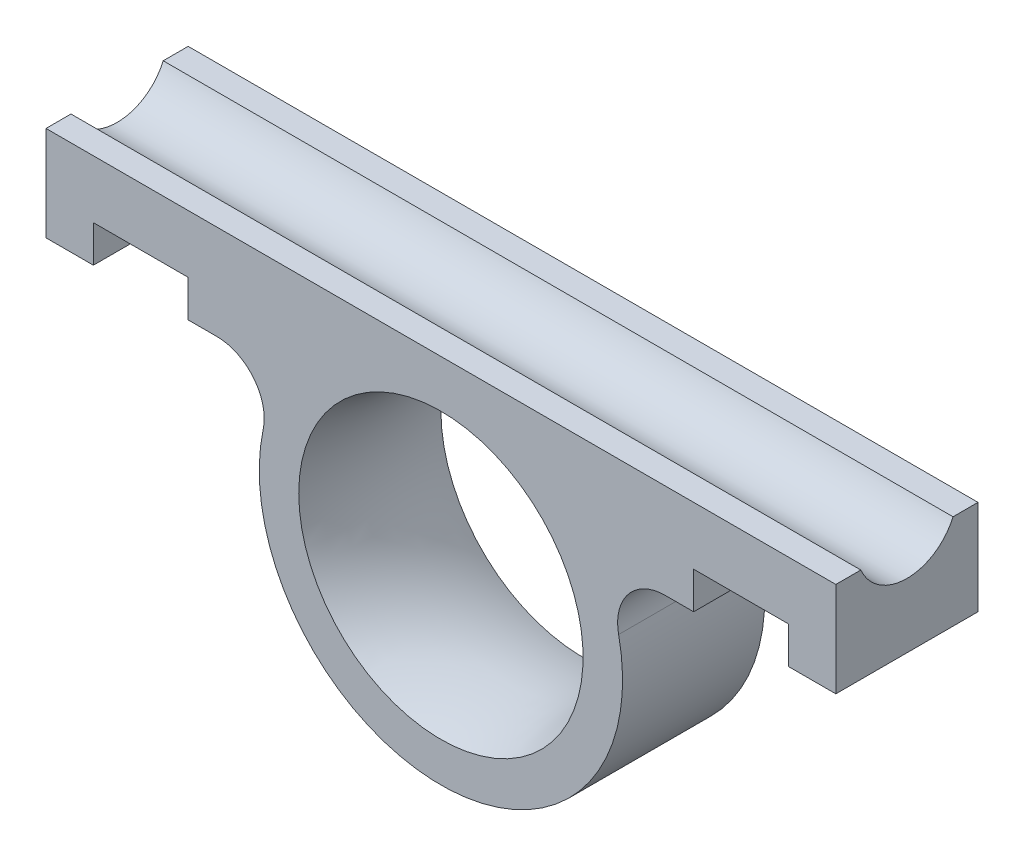
ISO-10303-21;
HEADER;
FILE_DESCRIPTION(('STEP AP214'),'2;1');
FILE_NAME('part.step','',(''),(''),'','','');
FILE_SCHEMA(('AUTOMOTIVE_DESIGN { 1 0 10303 214 1 1 1 1 }'));
ENDSEC;
DATA;
#1=APPLICATION_CONTEXT('core data for automotive mechanical design processes');
#2=APPLICATION_PROTOCOL_DEFINITION('international standard','automotive_design',2000,#1);
#3=PRODUCT_CONTEXT('',#1,'mechanical');
#4=PRODUCT('Part','Part','',(#3));
#5=PRODUCT_RELATED_PRODUCT_CATEGORY('part','',(#4));
#6=PRODUCT_DEFINITION_FORMATION('','',#4);
#7=PRODUCT_DEFINITION_CONTEXT('part definition',#1,'design');
#8=PRODUCT_DEFINITION('design','',#6,#7);
#9=PRODUCT_DEFINITION_SHAPE('','',#8);
#10=(LENGTH_UNIT() NAMED_UNIT(*) SI_UNIT(.MILLI.,.METRE.));
#11=(NAMED_UNIT(*) PLANE_ANGLE_UNIT() SI_UNIT($,.RADIAN.));
#12=(NAMED_UNIT(*) SI_UNIT($,.STERADIAN.) SOLID_ANGLE_UNIT());
#13=UNCERTAINTY_MEASURE_WITH_UNIT(LENGTH_MEASURE(1.E-05),#10,'distance_accuracy_value','');
#14=(GEOMETRIC_REPRESENTATION_CONTEXT(3) GLOBAL_UNCERTAINTY_ASSIGNED_CONTEXT((#13)) GLOBAL_UNIT_ASSIGNED_CONTEXT((#10,
#11,#12)) REPRESENTATION_CONTEXT('',''));
#15=CARTESIAN_POINT('',(0.,0.,0.));
#16=DIRECTION('',(0.,0.,1.));
#17=DIRECTION('',(1.,0.,0.));
#18=AXIS2_PLACEMENT_3D('',#15,#16,#17);
#19=CARTESIAN_POINT('',(-14.1862609591111,3.,9.));
#20=DIRECTION('',(0.,0.,1.));
#21=DIRECTION('',(1.,0.,0.));
#22=AXIS2_PLACEMENT_3D('',#19,#20,#21);
#23=PLANE('',#22);
#24=CARTESIAN_POINT('',(0.,0.,9.));
#25=DIRECTION('',(0.,0.,-1.));
#26=DIRECTION('',(-1.,0.,0.));
#27=AXIS2_PLACEMENT_3D('',#24,#25,#26);
#28=CIRCLE('',#27,9.);
#29=CARTESIAN_POINT('',(-9.,0.,9.));
#30=VERTEX_POINT('',#29);
#31=EDGE_CURVE('E275',#30,#30,#28,.T.);
#32=ORIENTED_EDGE('',*,*,#31,.T.);
#33=EDGE_LOOP('',(#32));
#34=FACE_BOUND('',#33,.T.);
#35=DIRECTION('',(-1.,0.,0.));
#36=VECTOR('',#35,1.);
#37=CARTESIAN_POINT('',(31.2980546704707,8.33534165703035,9.));
#38=LINE('',#37,#36);
#39=CARTESIAN_POINT('',(22.,8.33534165703035,9.));
#40=VERTEX_POINT('',#39);
#41=CARTESIAN_POINT('',(16.,8.33534165703035,9.));
#42=VERTEX_POINT('',#41);
#43=EDGE_CURVE('E261',#40,#42,#38,.T.);
#44=ORIENTED_EDGE('',*,*,#43,.F.);
#45=DIRECTION('',(0.,-1.,0.));
#46=VECTOR('',#45,1.);
#47=CARTESIAN_POINT('',(22.,7.00000000000001,9.));
#48=LINE('',#47,#46);
#49=CARTESIAN_POINT('',(22.,6.00000000000001,9.));
#50=VERTEX_POINT('',#49);
#51=EDGE_CURVE('E145',#40,#50,#48,.T.);
#52=ORIENTED_EDGE('',*,*,#51,.T.);
#53=DIRECTION('',(1.,0.,0.));
#54=VECTOR('',#53,1.);
#55=CARTESIAN_POINT('',(22.,6.00000000000001,9.));
#56=LINE('',#55,#54);
#57=CARTESIAN_POINT('',(25.,6.00000000000001,9.));
#58=VERTEX_POINT('',#57);
#59=EDGE_CURVE('E138',#50,#58,#56,.T.);
#60=ORIENTED_EDGE('',*,*,#59,.T.);
#61=DIRECTION('',(0.,1.,0.));
#62=VECTOR('',#61,1.);
#63=CARTESIAN_POINT('',(25.,12.,9.));
#64=LINE('',#63,#62);
#65=CARTESIAN_POINT('',(25.,12.,9.));
#66=VERTEX_POINT('',#65);
#67=EDGE_CURVE('E142',#58,#66,#64,.T.);
#68=ORIENTED_EDGE('',*,*,#67,.T.);
#69=DIRECTION('',(-1.,0.,0.));
#70=VECTOR('',#69,1.);
#71=CARTESIAN_POINT('',(-25.,12.,9.));
#72=LINE('',#71,#70);
#73=CARTESIAN_POINT('',(-25.,12.,9.));
#74=VERTEX_POINT('',#73);
#75=EDGE_CURVE('E57',#66,#74,#72,.T.);
#76=ORIENTED_EDGE('',*,*,#75,.T.);
#77=DIRECTION('',(0.,-1.,0.));
#78=VECTOR('',#77,1.);
#79=CARTESIAN_POINT('',(-25.,12.,9.));
#80=LINE('',#79,#78);
#81=CARTESIAN_POINT('',(-25.,6.,9.));
#82=VERTEX_POINT('',#81);
#83=EDGE_CURVE('E198',#74,#82,#80,.T.);
#84=ORIENTED_EDGE('',*,*,#83,.T.);
#85=DIRECTION('',(1.,0.,0.));
#86=VECTOR('',#85,1.);
#87=CARTESIAN_POINT('',(-25.,6.,9.));
#88=LINE('',#87,#86);
#89=CARTESIAN_POINT('',(-22.,6.,9.));
#90=VERTEX_POINT('',#89);
#91=EDGE_CURVE('E111',#82,#90,#88,.T.);
#92=ORIENTED_EDGE('',*,*,#91,.T.);
#93=DIRECTION('',(0.,1.,0.));
#94=VECTOR('',#93,1.);
#95=CARTESIAN_POINT('',(-22.,6.,9.));
#96=LINE('',#95,#94);
#97=CARTESIAN_POINT('',(-22.,8.33534165703034,9.));
#98=VERTEX_POINT('',#97);
#99=EDGE_CURVE('E234',#90,#98,#96,.T.);
#100=ORIENTED_EDGE('',*,*,#99,.T.);
#101=DIRECTION('',(-1.,0.,0.));
#102=VECTOR('',#101,1.);
#103=CARTESIAN_POINT('',(23.0812579761706,8.33534165703042,9.));
#104=LINE('',#103,#102);
#105=CARTESIAN_POINT('',(-16.,8.33534165703035,9.));
#106=VERTEX_POINT('',#105);
#107=EDGE_CURVE('E295',#106,#98,#104,.T.);
#108=ORIENTED_EDGE('',*,*,#107,.F.);
#109=DIRECTION('',(0.,-1.,0.));
#110=VECTOR('',#109,1.);
#111=CARTESIAN_POINT('',(-16.,7.,9.));
#112=LINE('',#111,#110);
#113=CARTESIAN_POINT('',(-16.,6.,9.));
#114=VERTEX_POINT('',#113);
#115=EDGE_CURVE('E242',#106,#114,#112,.T.);
#116=ORIENTED_EDGE('',*,*,#115,.T.);
#117=DIRECTION('',(1.,0.,0.));
#118=VECTOR('',#117,1.);
#119=CARTESIAN_POINT('',(-16.,6.,9.));
#120=LINE('',#119,#118);
#121=CARTESIAN_POINT('',(-14.1862609591111,6.,9.));
#122=VERTEX_POINT('',#121);
#123=EDGE_CURVE('E244',#114,#122,#120,.T.);
#124=ORIENTED_EDGE('',*,*,#123,.T.);
#125=CARTESIAN_POINT('',(-14.1862609591111,3.,9.));
#126=DIRECTION('',(0.,0.,-1.));
#127=DIRECTION('',(1.,0.,0.));
#128=AXIS2_PLACEMENT_3D('',#125,#126,#127);
#129=CIRCLE('',#128,3.);
#130=CARTESIAN_POINT('',(-11.2511724848123,2.37931034482759,9.));
#131=VERTEX_POINT('',#130);
#132=EDGE_CURVE('E246',#122,#131,#129,.T.);
#133=ORIENTED_EDGE('',*,*,#132,.T.);
#134=CARTESIAN_POINT('',(0.,0.,9.));
#135=DIRECTION('',(0.,0.,1.));
#136=DIRECTION('',(1.,0.,0.));
#137=AXIS2_PLACEMENT_3D('',#134,#135,#136);
#138=CIRCLE('',#137,11.5);
#139=CARTESIAN_POINT('',(11.2511724848123,2.37931034482759,9.));
#140=VERTEX_POINT('',#139);
#141=EDGE_CURVE('E248',#131,#140,#138,.T.);
#142=ORIENTED_EDGE('',*,*,#141,.T.);
#143=CARTESIAN_POINT('',(14.1862609591111,3.,9.));
#144=DIRECTION('',(0.,0.,-1.));
#145=DIRECTION('',(1.,0.,0.));
#146=AXIS2_PLACEMENT_3D('',#143,#144,#145);
#147=CIRCLE('',#146,3.);
#148=CARTESIAN_POINT('',(14.1862609591111,6.,9.));
#149=VERTEX_POINT('',#148);
#150=EDGE_CURVE('E250',#140,#149,#147,.T.);
#151=ORIENTED_EDGE('',*,*,#150,.T.);
#152=DIRECTION('',(1.,0.,0.));
#153=VECTOR('',#152,1.);
#154=CARTESIAN_POINT('',(14.1862609591111,6.,9.));
#155=LINE('',#154,#153);
#156=CARTESIAN_POINT('',(16.,6.,9.));
#157=VERTEX_POINT('',#156);
#158=EDGE_CURVE('E252',#149,#157,#155,.T.);
#159=ORIENTED_EDGE('',*,*,#158,.T.);
#160=DIRECTION('',(0.,1.,0.));
#161=VECTOR('',#160,1.);
#162=CARTESIAN_POINT('',(16.,6.,9.));
#163=LINE('',#162,#161);
#164=EDGE_CURVE('E254',#157,#42,#163,.T.);
#165=ORIENTED_EDGE('',*,*,#164,.T.);
#166=EDGE_LOOP('',(#44,#52,#60,#68,#76,#84,#92,#100,#108,#116,#124,#133,#142,#151,#159,#165));
#167=FACE_BOUND('',#166,.T.);
#168=ADVANCED_FACE('F33',(#34,#167),#23,.T.);
#169=CARTESIAN_POINT('',(-14.1862609591111,3.,0.));
#170=DIRECTION('',(0.,0.,1.));
#171=DIRECTION('',(1.,0.,0.));
#172=AXIS2_PLACEMENT_3D('',#169,#170,#171);
#173=PLANE('',#172);
#174=CARTESIAN_POINT('',(0.,0.,0.));
#175=DIRECTION('',(0.,0.,-1.));
#176=DIRECTION('',(-1.,0.,0.));
#177=AXIS2_PLACEMENT_3D('',#174,#175,#176);
#178=CIRCLE('',#177,9.);
#179=CARTESIAN_POINT('',(-9.,0.,0.));
#180=VERTEX_POINT('',#179);
#181=EDGE_CURVE('E416',#180,#180,#178,.T.);
#182=ORIENTED_EDGE('',*,*,#181,.F.);
#183=EDGE_LOOP('',(#182));
#184=FACE_BOUND('',#183,.T.);
#185=DIRECTION('',(0.,-1.,0.));
#186=VECTOR('',#185,1.);
#187=CARTESIAN_POINT('',(22.,7.00000000000001,0.));
#188=LINE('',#187,#186);
#189=CARTESIAN_POINT('',(22.,8.33534165703035,0.));
#190=VERTEX_POINT('',#189);
#191=CARTESIAN_POINT('',(22.,6.00000000000001,0.));
#192=VERTEX_POINT('',#191);
#193=EDGE_CURVE('E191',#190,#192,#188,.T.);
#194=ORIENTED_EDGE('',*,*,#193,.F.);
#195=DIRECTION('',(-1.,0.,0.));
#196=VECTOR('',#195,1.);
#197=CARTESIAN_POINT('',(31.2980546704707,8.33534165703035,0.));
#198=LINE('',#197,#196);
#199=CARTESIAN_POINT('',(16.,8.33534165703035,0.));
#200=VERTEX_POINT('',#199);
#201=EDGE_CURVE('E282',#190,#200,#198,.T.);
#202=ORIENTED_EDGE('',*,*,#201,.T.);
#203=DIRECTION('',(0.,1.,0.));
#204=VECTOR('',#203,1.);
#205=CARTESIAN_POINT('',(16.,6.,0.));
#206=LINE('',#205,#204);
#207=CARTESIAN_POINT('',(16.,6.,0.));
#208=VERTEX_POINT('',#207);
#209=EDGE_CURVE('E188',#208,#200,#206,.T.);
#210=ORIENTED_EDGE('',*,*,#209,.F.);
#211=DIRECTION('',(1.,0.,0.));
#212=VECTOR('',#211,1.);
#213=CARTESIAN_POINT('',(14.1862609591111,6.,0.));
#214=LINE('',#213,#212);
#215=CARTESIAN_POINT('',(14.1862609591111,6.,0.));
#216=VERTEX_POINT('',#215);
#217=EDGE_CURVE('E186',#216,#208,#214,.T.);
#218=ORIENTED_EDGE('',*,*,#217,.F.);
#219=CARTESIAN_POINT('',(14.1862609591111,3.,0.));
#220=DIRECTION('',(0.,0.,-1.));
#221=DIRECTION('',(1.,0.,0.));
#222=AXIS2_PLACEMENT_3D('',#219,#220,#221);
#223=CIRCLE('',#222,3.);
#224=CARTESIAN_POINT('',(11.2511724848123,2.37931034482759,0.));
#225=VERTEX_POINT('',#224);
#226=EDGE_CURVE('E184',#225,#216,#223,.T.);
#227=ORIENTED_EDGE('',*,*,#226,.F.);
#228=CARTESIAN_POINT('',(0.,0.,0.));
#229=DIRECTION('',(0.,0.,1.));
#230=DIRECTION('',(1.,0.,0.));
#231=AXIS2_PLACEMENT_3D('',#228,#229,#230);
#232=CIRCLE('',#231,11.5);
#233=CARTESIAN_POINT('',(-11.2511724848123,2.37931034482759,0.));
#234=VERTEX_POINT('',#233);
#235=EDGE_CURVE('E182',#234,#225,#232,.T.);
#236=ORIENTED_EDGE('',*,*,#235,.F.);
#237=CARTESIAN_POINT('',(-14.1862609591111,3.,0.));
#238=DIRECTION('',(0.,0.,-1.));
#239=DIRECTION('',(1.,0.,0.));
#240=AXIS2_PLACEMENT_3D('',#237,#238,#239);
#241=CIRCLE('',#240,3.);
#242=CARTESIAN_POINT('',(-14.1862609591111,6.,0.));
#243=VERTEX_POINT('',#242);
#244=EDGE_CURVE('E180',#243,#234,#241,.T.);
#245=ORIENTED_EDGE('',*,*,#244,.F.);
#246=DIRECTION('',(1.,0.,0.));
#247=VECTOR('',#246,1.);
#248=CARTESIAN_POINT('',(-16.,6.,0.));
#249=LINE('',#248,#247);
#250=CARTESIAN_POINT('',(-16.,6.,0.));
#251=VERTEX_POINT('',#250);
#252=EDGE_CURVE('E178',#251,#243,#249,.T.);
#253=ORIENTED_EDGE('',*,*,#252,.F.);
#254=DIRECTION('',(0.,-1.,0.));
#255=VECTOR('',#254,1.);
#256=CARTESIAN_POINT('',(-16.,7.,0.));
#257=LINE('',#256,#255);
#258=CARTESIAN_POINT('',(-16.,8.33534165703035,0.));
#259=VERTEX_POINT('',#258);
#260=EDGE_CURVE('E176',#259,#251,#257,.T.);
#261=ORIENTED_EDGE('',*,*,#260,.F.);
#262=DIRECTION('',(-1.,0.,0.));
#263=VECTOR('',#262,1.);
#264=CARTESIAN_POINT('',(23.0812579761706,8.33534165703042,0.));
#265=LINE('',#264,#263);
#266=CARTESIAN_POINT('',(-22.,8.33534165703034,0.));
#267=VERTEX_POINT('',#266);
#268=EDGE_CURVE('E290',#259,#267,#265,.T.);
#269=ORIENTED_EDGE('',*,*,#268,.T.);
#270=DIRECTION('',(0.,1.,0.));
#271=VECTOR('',#270,1.);
#272=CARTESIAN_POINT('',(-22.,6.,0.));
#273=LINE('',#272,#271);
#274=CARTESIAN_POINT('',(-22.,6.,0.));
#275=VERTEX_POINT('',#274);
#276=EDGE_CURVE('E173',#275,#267,#273,.T.);
#277=ORIENTED_EDGE('',*,*,#276,.F.);
#278=DIRECTION('',(1.,0.,0.));
#279=VECTOR('',#278,1.);
#280=CARTESIAN_POINT('',(-25.,6.,0.));
#281=LINE('',#280,#279);
#282=CARTESIAN_POINT('',(-25.,6.,0.));
#283=VERTEX_POINT('',#282);
#284=EDGE_CURVE('E171',#283,#275,#281,.T.);
#285=ORIENTED_EDGE('',*,*,#284,.F.);
#286=DIRECTION('',(0.,-1.,0.));
#287=VECTOR('',#286,1.);
#288=CARTESIAN_POINT('',(-25.,12.,0.));
#289=LINE('',#288,#287);
#290=CARTESIAN_POINT('',(-25.,12.,0.));
#291=VERTEX_POINT('',#290);
#292=EDGE_CURVE('E169',#291,#283,#289,.T.);
#293=ORIENTED_EDGE('',*,*,#292,.F.);
#294=DIRECTION('',(-1.,0.,0.));
#295=VECTOR('',#294,1.);
#296=CARTESIAN_POINT('',(-25.,12.,0.));
#297=LINE('',#296,#295);
#298=CARTESIAN_POINT('',(25.,12.,0.));
#299=VERTEX_POINT('',#298);
#300=EDGE_CURVE('E196',#299,#291,#297,.T.);
#301=ORIENTED_EDGE('',*,*,#300,.F.);
#302=DIRECTION('',(0.,1.,0.));
#303=VECTOR('',#302,1.);
#304=CARTESIAN_POINT('',(25.,12.,0.));
#305=LINE('',#304,#303);
#306=CARTESIAN_POINT('',(25.,6.00000000000001,0.));
#307=VERTEX_POINT('',#306);
#308=EDGE_CURVE('E194',#307,#299,#305,.T.);
#309=ORIENTED_EDGE('',*,*,#308,.F.);
#310=DIRECTION('',(1.,0.,0.));
#311=VECTOR('',#310,1.);
#312=CARTESIAN_POINT('',(22.,6.00000000000001,0.));
#313=LINE('',#312,#311);
#314=EDGE_CURVE('E154',#192,#307,#313,.T.);
#315=ORIENTED_EDGE('',*,*,#314,.F.);
#316=EDGE_LOOP('',(#194,#202,#210,#218,#227,#236,#245,#253,#261,#269,#277,#285,#293,#301,#309,#315));
#317=FACE_BOUND('',#316,.T.);
#318=ADVANCED_FACE('F305',(#184,#317),#173,.F.);
#319=CARTESIAN_POINT('',(-25.,12.,9.));
#320=DIRECTION('',(0.,-1.,0.));
#321=DIRECTION('',(1.,0.,0.));
#322=AXIS2_PLACEMENT_3D('',#319,#320,#321);
#323=PLANE('',#322);
#324=DIRECTION('',(0.,0.,-1.));
#325=VECTOR('',#324,1.);
#326=CARTESIAN_POINT('',(-25.,12.,9.));
#327=LINE('',#326,#325);
#328=CARTESIAN_POINT('',(-25.,12.,1.58141729601507));
#329=VERTEX_POINT('',#328);
#330=EDGE_CURVE('E102',#329,#291,#327,.T.);
#331=ORIENTED_EDGE('',*,*,#330,.F.);
#332=DIRECTION('',(1.,0.,0.));
#333=VECTOR('',#332,1.);
#334=CARTESIAN_POINT('',(-25.,12.,1.58141729601507));
#335=LINE('',#334,#333);
#336=CARTESIAN_POINT('',(25.,12.,1.58141729601507));
#337=VERTEX_POINT('',#336);
#338=EDGE_CURVE('E12',#329,#337,#335,.T.);
#339=ORIENTED_EDGE('',*,*,#338,.T.);
#340=DIRECTION('',(0.,0.,-1.));
#341=VECTOR('',#340,1.);
#342=CARTESIAN_POINT('',(25.,12.,9.));
#343=LINE('',#342,#341);
#344=EDGE_CURVE('E202',#337,#299,#343,.T.);
#345=ORIENTED_EDGE('',*,*,#344,.T.);
#346=ORIENTED_EDGE('',*,*,#300,.T.);
#347=EDGE_LOOP('',(#331,#339,#345,#346));
#348=FACE_BOUND('',#347,.T.);
#349=ADVANCED_FACE('F300',(#348),#323,.F.);
#350=CARTESIAN_POINT('',(-25.,12.,9.));
#351=DIRECTION('',(1.,0.,0.));
#352=DIRECTION('',(0.,0.,-1.));
#353=AXIS2_PLACEMENT_3D('',#350,#351,#352);
#354=PLANE('',#353);
#355=CARTESIAN_POINT('',(-25.,12.,7.41858270398493));
#356=VERTEX_POINT('',#355);
#357=EDGE_CURVE('E199',#74,#356,#327,.T.);
#358=ORIENTED_EDGE('',*,*,#357,.T.);
#359=CARTESIAN_POINT('',(-25.,13.25,4.5));
#360=DIRECTION('',(1.,0.,0.));
#361=DIRECTION('',(0.,0.,-1.));
#362=AXIS2_PLACEMENT_3D('',#359,#360,#361);
#363=CIRCLE('',#362,3.175);
#364=EDGE_CURVE('E48',#356,#329,#363,.T.);
#365=ORIENTED_EDGE('',*,*,#364,.T.);
#366=ORIENTED_EDGE('',*,*,#330,.T.);
#367=ORIENTED_EDGE('',*,*,#292,.T.);
#368=DIRECTION('',(0.,0.,-1.));
#369=VECTOR('',#368,1.);
#370=CARTESIAN_POINT('',(-25.,6.,9.));
#371=LINE('',#370,#369);
#372=EDGE_CURVE('E226',#82,#283,#371,.T.);
#373=ORIENTED_EDGE('',*,*,#372,.F.);
#374=ORIENTED_EDGE('',*,*,#83,.F.);
#375=EDGE_LOOP('',(#358,#365,#366,#367,#373,#374));
#376=FACE_BOUND('',#375,.T.);
#377=ADVANCED_FACE('F35',(#376),#354,.F.);
#378=CARTESIAN_POINT('',(-25.,6.,9.));
#379=DIRECTION('',(0.,1.,0.));
#380=DIRECTION('',(0.,0.,1.));
#381=AXIS2_PLACEMENT_3D('',#378,#379,#380);
#382=PLANE('',#381);
#383=ORIENTED_EDGE('',*,*,#284,.T.);
#384=DIRECTION('',(0.,0.,-1.));
#385=VECTOR('',#384,1.);
#386=CARTESIAN_POINT('',(-22.,6.,9.));
#387=LINE('',#386,#385);
#388=EDGE_CURVE('E223',#90,#275,#387,.T.);
#389=ORIENTED_EDGE('',*,*,#388,.F.);
#390=ORIENTED_EDGE('',*,*,#91,.F.);
#391=ORIENTED_EDGE('',*,*,#372,.T.);
#392=EDGE_LOOP('',(#383,#389,#390,#391));
#393=FACE_BOUND('',#392,.T.);
#394=ADVANCED_FACE('F307',(#393),#382,.F.);
#395=CARTESIAN_POINT('',(-22.,6.,9.));
#396=DIRECTION('',(-1.,0.,0.));
#397=DIRECTION('',(0.,-1.,0.));
#398=AXIS2_PLACEMENT_3D('',#395,#396,#397);
#399=PLANE('',#398);
#400=ORIENTED_EDGE('',*,*,#276,.T.);
#401=CARTESIAN_POINT('',(-22.,15.25,4.5));
#402=DIRECTION('',(1.,0.,0.));
#403=DIRECTION('',(0.,1.,0.));
#404=AXIS2_PLACEMENT_3D('',#401,#402,#403);
#405=CIRCLE('',#404,8.24999999999997);
#406=EDGE_CURVE('E287',#98,#267,#405,.T.);
#407=ORIENTED_EDGE('',*,*,#406,.F.);
#408=ORIENTED_EDGE('',*,*,#99,.F.);
#409=ORIENTED_EDGE('',*,*,#388,.T.);
#410=EDGE_LOOP('',(#400,#407,#408,#409));
#411=FACE_BOUND('',#410,.T.);
#412=ADVANCED_FACE('F309',(#411),#399,.F.);
#413=CARTESIAN_POINT('',(-16.,7.,9.));
#414=DIRECTION('',(1.,0.,0.));
#415=DIRECTION('',(0.,0.,-1.));
#416=AXIS2_PLACEMENT_3D('',#413,#414,#415);
#417=PLANE('',#416);
#418=ORIENTED_EDGE('',*,*,#260,.T.);
#419=DIRECTION('',(0.,0.,-1.));
#420=VECTOR('',#419,1.);
#421=CARTESIAN_POINT('',(-16.,6.,9.));
#422=LINE('',#421,#420);
#423=EDGE_CURVE('E220',#114,#251,#422,.T.);
#424=ORIENTED_EDGE('',*,*,#423,.F.);
#425=ORIENTED_EDGE('',*,*,#115,.F.);
#426=CARTESIAN_POINT('',(-16.,15.25,4.5));
#427=DIRECTION('',(1.,0.,0.));
#428=DIRECTION('',(0.,0.,-1.));
#429=AXIS2_PLACEMENT_3D('',#426,#427,#428);
#430=CIRCLE('',#429,8.24999999999997);
#431=EDGE_CURVE('E286',#106,#259,#430,.T.);
#432=ORIENTED_EDGE('',*,*,#431,.T.);
#433=EDGE_LOOP('',(#418,#424,#425,#432));
#434=FACE_BOUND('',#433,.T.);
#435=ADVANCED_FACE('F314',(#434),#417,.F.);
#436=CARTESIAN_POINT('',(-16.,6.,9.));
#437=DIRECTION('',(0.,1.,0.));
#438=DIRECTION('',(-1.,0.,0.));
#439=AXIS2_PLACEMENT_3D('',#436,#437,#438);
#440=PLANE('',#439);
#441=ORIENTED_EDGE('',*,*,#252,.T.);
#442=DIRECTION('',(0.,0.,-1.));
#443=VECTOR('',#442,1.);
#444=CARTESIAN_POINT('',(-14.1862609591111,6.,9.));
#445=LINE('',#444,#443);
#446=EDGE_CURVE('E217',#122,#243,#445,.T.);
#447=ORIENTED_EDGE('',*,*,#446,.F.);
#448=ORIENTED_EDGE('',*,*,#123,.F.);
#449=ORIENTED_EDGE('',*,*,#423,.T.);
#450=EDGE_LOOP('',(#441,#447,#448,#449));
#451=FACE_BOUND('',#450,.T.);
#452=ADVANCED_FACE('F357',(#451),#440,.F.);
#453=CARTESIAN_POINT('',(-14.1862609591111,3.,9.));
#454=DIRECTION('',(0.,0.,-1.));
#455=DIRECTION('',(-1.,0.,0.));
#456=AXIS2_PLACEMENT_3D('',#453,#454,#455);
#457=CYLINDRICAL_SURFACE('',#456,3.);
#458=ORIENTED_EDGE('',*,*,#244,.T.);
#459=DIRECTION('',(0.,0.,-1.));
#460=VECTOR('',#459,1.);
#461=CARTESIAN_POINT('',(-11.2511724848123,2.37931034482759,9.));
#462=LINE('',#461,#460);
#463=EDGE_CURVE('E214',#131,#234,#462,.T.);
#464=ORIENTED_EDGE('',*,*,#463,.F.);
#465=ORIENTED_EDGE('',*,*,#132,.F.);
#466=ORIENTED_EDGE('',*,*,#446,.T.);
#467=EDGE_LOOP('',(#458,#464,#465,#466));
#468=FACE_BOUND('',#467,.T.);
#469=ADVANCED_FACE('F353',(#468),#457,.F.);
#470=CARTESIAN_POINT('',(0.,0.,9.));
#471=DIRECTION('',(0.,0.,-1.));
#472=DIRECTION('',(-1.,0.,0.));
#473=AXIS2_PLACEMENT_3D('',#470,#471,#472);
#474=CYLINDRICAL_SURFACE('',#473,11.5);
#475=ORIENTED_EDGE('',*,*,#235,.T.);
#476=DIRECTION('',(0.,0.,-1.));
#477=VECTOR('',#476,1.);
#478=CARTESIAN_POINT('',(11.2511724848123,2.37931034482759,9.));
#479=LINE('',#478,#477);
#480=EDGE_CURVE('E211',#140,#225,#479,.T.);
#481=ORIENTED_EDGE('',*,*,#480,.F.);
#482=ORIENTED_EDGE('',*,*,#141,.F.);
#483=ORIENTED_EDGE('',*,*,#463,.T.);
#484=EDGE_LOOP('',(#475,#481,#482,#483));
#485=FACE_BOUND('',#484,.T.);
#486=ADVANCED_FACE('F349',(#485),#474,.T.);
#487=CARTESIAN_POINT('',(14.1862609591111,3.,9.));
#488=DIRECTION('',(0.,0.,-1.));
#489=DIRECTION('',(-1.,0.,0.));
#490=AXIS2_PLACEMENT_3D('',#487,#488,#489);
#491=CYLINDRICAL_SURFACE('',#490,3.);
#492=ORIENTED_EDGE('',*,*,#226,.T.);
#493=DIRECTION('',(0.,0.,-1.));
#494=VECTOR('',#493,1.);
#495=CARTESIAN_POINT('',(14.1862609591111,6.,9.));
#496=LINE('',#495,#494);
#497=EDGE_CURVE('E208',#149,#216,#496,.T.);
#498=ORIENTED_EDGE('',*,*,#497,.F.);
#499=ORIENTED_EDGE('',*,*,#150,.F.);
#500=ORIENTED_EDGE('',*,*,#480,.T.);
#501=EDGE_LOOP('',(#492,#498,#499,#500));
#502=FACE_BOUND('',#501,.T.);
#503=ADVANCED_FACE('F345',(#502),#491,.F.);
#504=CARTESIAN_POINT('',(14.1862609591111,6.,9.));
#505=DIRECTION('',(0.,1.,0.));
#506=DIRECTION('',(-1.,0.,0.));
#507=AXIS2_PLACEMENT_3D('',#504,#505,#506);
#508=PLANE('',#507);
#509=ORIENTED_EDGE('',*,*,#217,.T.);
#510=DIRECTION('',(0.,0.,-1.));
#511=VECTOR('',#510,1.);
#512=CARTESIAN_POINT('',(16.,6.,9.));
#513=LINE('',#512,#511);
#514=EDGE_CURVE('E205',#157,#208,#513,.T.);
#515=ORIENTED_EDGE('',*,*,#514,.F.);
#516=ORIENTED_EDGE('',*,*,#158,.F.);
#517=ORIENTED_EDGE('',*,*,#497,.T.);
#518=EDGE_LOOP('',(#509,#515,#516,#517));
#519=FACE_BOUND('',#518,.T.);
#520=ADVANCED_FACE('F342',(#519),#508,.F.);
#521=CARTESIAN_POINT('',(16.,6.,9.));
#522=DIRECTION('',(-1.,0.,0.));
#523=DIRECTION('',(0.,0.,1.));
#524=AXIS2_PLACEMENT_3D('',#521,#522,#523);
#525=PLANE('',#524);
#526=ORIENTED_EDGE('',*,*,#209,.T.);
#527=CARTESIAN_POINT('',(16.,15.25,4.5));
#528=DIRECTION('',(1.,0.,0.));
#529=DIRECTION('',(0.,0.,1.));
#530=AXIS2_PLACEMENT_3D('',#527,#528,#529);
#531=CIRCLE('',#530,8.24999999999997);
#532=EDGE_CURVE('E269',#42,#200,#531,.T.);
#533=ORIENTED_EDGE('',*,*,#532,.F.);
#534=ORIENTED_EDGE('',*,*,#164,.F.);
#535=ORIENTED_EDGE('',*,*,#514,.T.);
#536=EDGE_LOOP('',(#526,#533,#534,#535));
#537=FACE_BOUND('',#536,.T.);
#538=ADVANCED_FACE('F270',(#537),#525,.F.);
#539=CARTESIAN_POINT('',(22.,7.00000000000001,9.));
#540=DIRECTION('',(1.,0.,0.));
#541=DIRECTION('',(0.,1.,0.));
#542=AXIS2_PLACEMENT_3D('',#539,#540,#541);
#543=PLANE('',#542);
#544=ORIENTED_EDGE('',*,*,#193,.T.);
#545=DIRECTION('',(0.,0.,-1.));
#546=VECTOR('',#545,1.);
#547=CARTESIAN_POINT('',(22.,6.00000000000001,9.));
#548=LINE('',#547,#546);
#549=EDGE_CURVE('E158',#50,#192,#548,.T.);
#550=ORIENTED_EDGE('',*,*,#549,.F.);
#551=ORIENTED_EDGE('',*,*,#51,.F.);
#552=CARTESIAN_POINT('',(22.,15.25,4.5));
#553=DIRECTION('',(1.,0.,0.));
#554=DIRECTION('',(0.,1.,0.));
#555=AXIS2_PLACEMENT_3D('',#552,#553,#554);
#556=CIRCLE('',#555,8.24999999999997);
#557=EDGE_CURVE('E280',#40,#190,#556,.T.);
#558=ORIENTED_EDGE('',*,*,#557,.T.);
#559=EDGE_LOOP('',(#544,#550,#551,#558));
#560=FACE_BOUND('',#559,.T.);
#561=ADVANCED_FACE('F336',(#560),#543,.F.);
#562=CARTESIAN_POINT('',(22.,6.00000000000001,9.));
#563=DIRECTION('',(0.,1.,0.));
#564=DIRECTION('',(-1.,0.,0.));
#565=AXIS2_PLACEMENT_3D('',#562,#563,#564);
#566=PLANE('',#565);
#567=ORIENTED_EDGE('',*,*,#314,.T.);
#568=DIRECTION('',(0.,0.,-1.));
#569=VECTOR('',#568,1.);
#570=CARTESIAN_POINT('',(25.,6.00000000000001,9.));
#571=LINE('',#570,#569);
#572=EDGE_CURVE('E151',#58,#307,#571,.T.);
#573=ORIENTED_EDGE('',*,*,#572,.F.);
#574=ORIENTED_EDGE('',*,*,#59,.F.);
#575=ORIENTED_EDGE('',*,*,#549,.T.);
#576=EDGE_LOOP('',(#567,#573,#574,#575));
#577=FACE_BOUND('',#576,.T.);
#578=ADVANCED_FACE('F152',(#577),#566,.F.);
#579=CARTESIAN_POINT('',(25.,12.,9.));
#580=DIRECTION('',(-1.,0.,0.));
#581=DIRECTION('',(0.,0.,1.));
#582=AXIS2_PLACEMENT_3D('',#579,#580,#581);
#583=PLANE('',#582);
#584=ORIENTED_EDGE('',*,*,#344,.F.);
#585=CARTESIAN_POINT('',(25.,13.25,4.5));
#586=DIRECTION('',(1.,0.,0.));
#587=DIRECTION('',(0.,0.,-1.));
#588=AXIS2_PLACEMENT_3D('',#585,#586,#587);
#589=CIRCLE('',#588,3.175);
#590=CARTESIAN_POINT('',(25.,12.,7.41858270398493));
#591=VERTEX_POINT('',#590);
#592=EDGE_CURVE('E237',#591,#337,#589,.T.);
#593=ORIENTED_EDGE('',*,*,#592,.F.);
#594=EDGE_CURVE('E159',#66,#591,#343,.T.);
#595=ORIENTED_EDGE('',*,*,#594,.F.);
#596=ORIENTED_EDGE('',*,*,#67,.F.);
#597=ORIENTED_EDGE('',*,*,#572,.T.);
#598=ORIENTED_EDGE('',*,*,#308,.T.);
#599=EDGE_LOOP('',(#584,#593,#595,#596,#597,#598));
#600=FACE_BOUND('',#599,.T.);
#601=ADVANCED_FACE('F162',(#600),#583,.F.);
#602=ORIENTED_EDGE('',*,*,#594,.T.);
#603=DIRECTION('',(1.,0.,0.));
#604=VECTOR('',#603,1.);
#605=CARTESIAN_POINT('',(-25.,12.,7.41858270398493));
#606=LINE('',#605,#604);
#607=EDGE_CURVE('E41',#591,#356,#606,.F.);
#608=ORIENTED_EDGE('',*,*,#607,.T.);
#609=ORIENTED_EDGE('',*,*,#357,.F.);
#610=ORIENTED_EDGE('',*,*,#75,.F.);
#611=EDGE_LOOP('',(#602,#608,#609,#610));
#612=FACE_BOUND('',#611,.T.);
#613=ADVANCED_FACE('F228',(#612),#323,.F.);
#614=CARTESIAN_POINT('',(-25.,13.25,4.5));
#615=DIRECTION('',(1.,0.,0.));
#616=DIRECTION('',(0.,0.,-1.));
#617=AXIS2_PLACEMENT_3D('',#614,#615,#616);
#618=CYLINDRICAL_SURFACE('',#617,3.175);
#619=ORIENTED_EDGE('',*,*,#364,.F.);
#620=ORIENTED_EDGE('',*,*,#607,.F.);
#621=ORIENTED_EDGE('',*,*,#592,.T.);
#622=ORIENTED_EDGE('',*,*,#338,.F.);
#623=EDGE_LOOP('',(#619,#620,#621,#622));
#624=FACE_BOUND('',#623,.T.);
#625=ADVANCED_FACE('F298',(#624),#618,.F.);
#626=CARTESIAN_POINT('',(23.0812579761706,15.2500000000001,4.5));
#627=DIRECTION('',(-1.,0.,0.));
#628=DIRECTION('',(0.,-1.,0.));
#629=AXIS2_PLACEMENT_3D('',#626,#627,#628);
#630=CYLINDRICAL_SURFACE('',#629,8.24999999999997);
#631=ORIENTED_EDGE('',*,*,#431,.F.);
#632=ORIENTED_EDGE('',*,*,#107,.T.);
#633=ORIENTED_EDGE('',*,*,#406,.T.);
#634=ORIENTED_EDGE('',*,*,#268,.F.);
#635=EDGE_LOOP('',(#631,#632,#633,#634));
#636=FACE_BOUND('',#635,.T.);
#637=ADVANCED_FACE('F388',(#636),#630,.T.);
#638=CARTESIAN_POINT('',(31.2980546704707,15.25,4.5));
#639=DIRECTION('',(-1.,0.,0.));
#640=DIRECTION('',(0.,0.,1.));
#641=AXIS2_PLACEMENT_3D('',#638,#639,#640);
#642=CYLINDRICAL_SURFACE('',#641,8.24999999999997);
#643=ORIENTED_EDGE('',*,*,#532,.T.);
#644=ORIENTED_EDGE('',*,*,#201,.F.);
#645=ORIENTED_EDGE('',*,*,#557,.F.);
#646=ORIENTED_EDGE('',*,*,#43,.T.);
#647=EDGE_LOOP('',(#643,#644,#645,#646));
#648=FACE_BOUND('',#647,.T.);
#649=ADVANCED_FACE('F278',(#648),#642,.T.);
#650=CARTESIAN_POINT('',(0.,0.,4.5));
#651=DIRECTION('',(0.,0.,-1.));
#652=DIRECTION('',(-1.,0.,0.));
#653=AXIS2_PLACEMENT_3D('',#650,#651,#652);
#654=TOROIDAL_SURFACE('',#653,22.125,13.875);
#655=ORIENTED_EDGE('',*,*,#181,.T.);
#656=EDGE_LOOP('',(#655));
#657=FACE_BOUND('',#656,.T.);
#658=ORIENTED_EDGE('',*,*,#31,.F.);
#659=EDGE_LOOP('',(#658));
#660=FACE_BOUND('',#659,.T.);
#661=ADVANCED_FACE('F406',(#657,#660),#654,.T.);
#662=CLOSED_SHELL('',(#168,#318,#349,#377,#394,#412,#435,#452,#469,#486,#503,#520,#538,#561,
#578,#601,#613,#625,#637,#649,#661));
#663=MANIFOLD_SOLID_BREP('B2',#662);
#664=ADVANCED_BREP_SHAPE_REPRESENTATION('',(#18,#663),#14);
#665=SHAPE_DEFINITION_REPRESENTATION(#9,#664);
ENDSEC;
END-ISO-10303-21;
